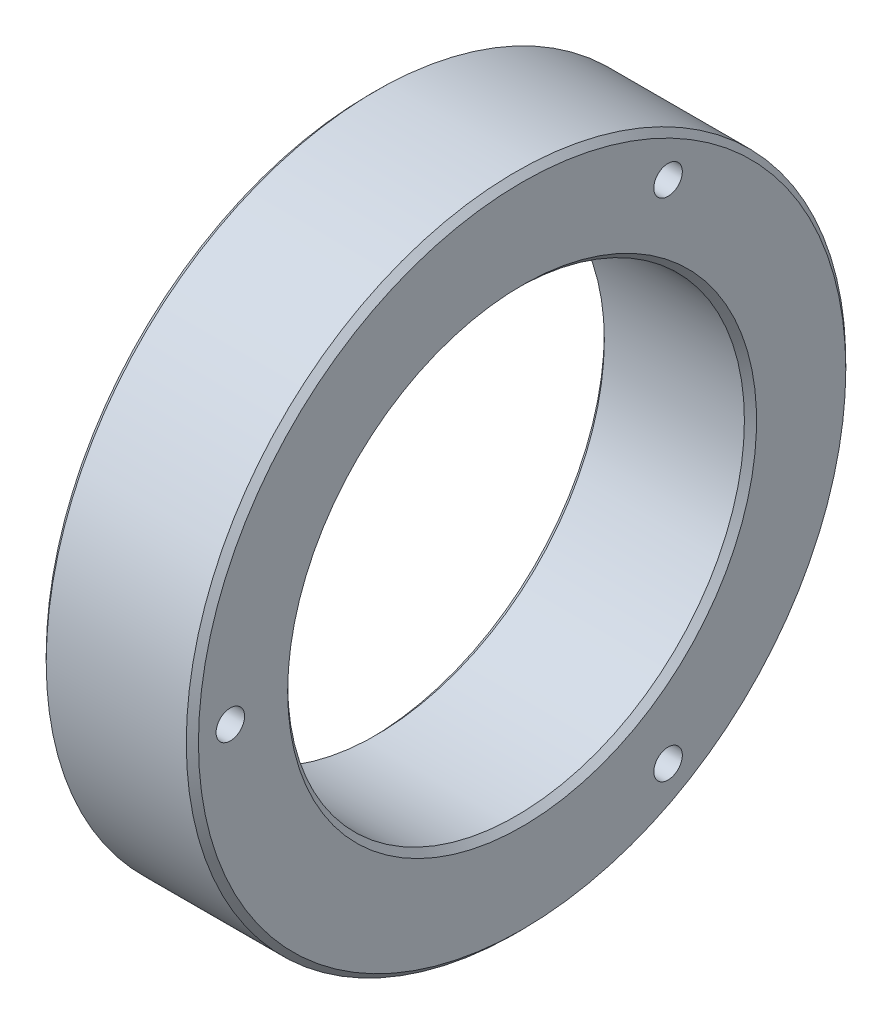
ISO-10303-21;
HEADER;
FILE_DESCRIPTION(('STEP AP214'),'2;1');
FILE_NAME('part.step','',(''),(''),'','','');
FILE_SCHEMA(('AUTOMOTIVE_DESIGN { 1 0 10303 214 1 1 1 1 }'));
ENDSEC;
DATA;
#1=APPLICATION_CONTEXT('core data for automotive mechanical design processes');
#2=APPLICATION_PROTOCOL_DEFINITION('international standard','automotive_design',2000,#1);
#3=PRODUCT_CONTEXT('',#1,'mechanical');
#4=PRODUCT('Part','Part','',(#3));
#5=PRODUCT_RELATED_PRODUCT_CATEGORY('part','',(#4));
#6=PRODUCT_DEFINITION_FORMATION('','',#4);
#7=PRODUCT_DEFINITION_CONTEXT('part definition',#1,'design');
#8=PRODUCT_DEFINITION('design','',#6,#7);
#9=PRODUCT_DEFINITION_SHAPE('','',#8);
#10=(LENGTH_UNIT() NAMED_UNIT(*) SI_UNIT(.MILLI.,.METRE.));
#11=(NAMED_UNIT(*) PLANE_ANGLE_UNIT() SI_UNIT($,.RADIAN.));
#12=(NAMED_UNIT(*) SI_UNIT($,.STERADIAN.) SOLID_ANGLE_UNIT());
#13=UNCERTAINTY_MEASURE_WITH_UNIT(LENGTH_MEASURE(1.E-05),#10,'distance_accuracy_value','');
#14=(GEOMETRIC_REPRESENTATION_CONTEXT(3) GLOBAL_UNCERTAINTY_ASSIGNED_CONTEXT((#13)) GLOBAL_UNIT_ASSIGNED_CONTEXT((#10,
#11,#12)) REPRESENTATION_CONTEXT('',''));
#15=CARTESIAN_POINT('',(0.,0.,0.));
#16=DIRECTION('',(0.,0.,1.));
#17=DIRECTION('',(1.,0.,0.));
#18=AXIS2_PLACEMENT_3D('',#15,#16,#17);
#19=CARTESIAN_POINT('',(0.,57.15,0.));
#20=DIRECTION('',(1.,0.,0.));
#21=DIRECTION('',(0.,0.,-1.));
#22=AXIS2_PLACEMENT_3D('',#19,#20,#21);
#23=PLANE('',#22);
#24=CARTESIAN_POINT('',(0.,69.85,0.));
#25=DIRECTION('',(1.,0.,0.));
#26=DIRECTION('',(0.,0.,-1.));
#27=AXIS2_PLACEMENT_3D('',#24,#25,#26);
#28=CIRCLE('',#27,3.96874999999999);
#29=CARTESIAN_POINT('',(0.,69.85,-3.96874999999999));
#30=VERTEX_POINT('',#29);
#31=EDGE_CURVE('E237',#30,#30,#28,.T.);
#32=ORIENTED_EDGE('',*,*,#31,.T.);
#33=EDGE_LOOP('',(#32));
#34=FACE_BOUND('',#33,.T.);
#35=CARTESIAN_POINT('',(0.,-69.85,0.));
#36=DIRECTION('',(1.,0.,0.));
#37=DIRECTION('',(0.,0.,-1.));
#38=AXIS2_PLACEMENT_3D('',#35,#36,#37);
#39=CIRCLE('',#38,3.96874999999999);
#40=CARTESIAN_POINT('',(0.,-69.85,-3.96874999999999));
#41=VERTEX_POINT('',#40);
#42=EDGE_CURVE('E96',#41,#41,#39,.T.);
#43=ORIENTED_EDGE('',*,*,#42,.T.);
#44=EDGE_LOOP('',(#43));
#45=FACE_BOUND('',#44,.T.);
#46=CARTESIAN_POINT('',(0.,63.246,-36.5252));
#47=DIRECTION('',(1.,0.,0.));
#48=DIRECTION('',(0.,0.,-1.));
#49=AXIS2_PLACEMENT_3D('',#46,#47,#48);
#50=CIRCLE('',#49,5.5626);
#51=CARTESIAN_POINT('',(0.,63.246,-42.0878));
#52=VERTEX_POINT('',#51);
#53=EDGE_CURVE('E88',#52,#52,#50,.T.);
#54=ORIENTED_EDGE('',*,*,#53,.T.);
#55=EDGE_LOOP('',(#54));
#56=FACE_BOUND('',#55,.T.);
#57=CARTESIAN_POINT('',(0.,-63.246,-36.5252));
#58=DIRECTION('',(1.,0.,0.));
#59=DIRECTION('',(0.,0.,-1.));
#60=AXIS2_PLACEMENT_3D('',#57,#58,#59);
#61=CIRCLE('',#60,5.5626);
#62=CARTESIAN_POINT('',(0.,-63.246,-42.0878));
#63=VERTEX_POINT('',#62);
#64=EDGE_CURVE('E78',#63,#63,#61,.T.);
#65=ORIENTED_EDGE('',*,*,#64,.T.);
#66=EDGE_LOOP('',(#65));
#67=FACE_BOUND('',#66,.T.);
#68=CARTESIAN_POINT('',(0.,0.,73.025));
#69=DIRECTION('',(1.,0.,0.));
#70=DIRECTION('',(0.,0.,-1.));
#71=AXIS2_PLACEMENT_3D('',#68,#69,#70);
#72=CIRCLE('',#71,5.5626);
#73=CARTESIAN_POINT('',(0.,0.,67.4624));
#74=VERTEX_POINT('',#73);
#75=EDGE_CURVE('E72',#74,#74,#72,.T.);
#76=ORIENTED_EDGE('',*,*,#75,.T.);
#77=EDGE_LOOP('',(#76));
#78=FACE_BOUND('',#77,.T.);
#79=CARTESIAN_POINT('',(0.,0.,0.));
#80=DIRECTION('',(1.,0.,0.));
#81=DIRECTION('',(0.,0.,-1.));
#82=AXIS2_PLACEMENT_3D('',#79,#80,#81);
#83=CIRCLE('',#82,58.674);
#84=CARTESIAN_POINT('',(0.,0.,-58.674));
#85=VERTEX_POINT('',#84);
#86=EDGE_CURVE('E57',#85,#85,#83,.T.);
#87=ORIENTED_EDGE('',*,*,#86,.T.);
#88=EDGE_LOOP('',(#87));
#89=FACE_BOUND('',#88,.T.);
#90=CARTESIAN_POINT('',(0.,0.,0.));
#91=DIRECTION('',(1.,0.,0.));
#92=DIRECTION('',(0.,0.,-1.));
#93=AXIS2_PLACEMENT_3D('',#90,#91,#92);
#94=CIRCLE('',#93,81.0006);
#95=CARTESIAN_POINT('',(0.,0.,-81.0006));
#96=VERTEX_POINT('',#95);
#97=EDGE_CURVE('E116',#96,#96,#94,.F.);
#98=ORIENTED_EDGE('',*,*,#97,.T.);
#99=EDGE_LOOP('',(#98));
#100=FACE_BOUND('',#99,.T.);
#101=ADVANCED_FACE('F43',(#34,#45,#56,#67,#78,#89,#100),#23,.F.);
#102=CARTESIAN_POINT('',(-25.4,0.,0.));
#103=DIRECTION('',(-1.,0.,0.));
#104=DIRECTION('',(0.,0.,1.));
#105=AXIS2_PLACEMENT_3D('',#102,#103,#104);
#106=CYLINDRICAL_SURFACE('',#105,82.5246);
#107=CARTESIAN_POINT('',(36.576,0.,0.));
#108=DIRECTION('',(-1.,0.,0.));
#109=DIRECTION('',(0.,0.,1.));
#110=AXIS2_PLACEMENT_3D('',#107,#108,#109);
#111=CIRCLE('',#110,82.5246);
#112=CARTESIAN_POINT('',(36.576,0.,82.5246));
#113=VERTEX_POINT('',#112);
#114=EDGE_CURVE('E10',#113,#113,#111,.T.);
#115=ORIENTED_EDGE('',*,*,#114,.T.);
#116=EDGE_LOOP('',(#115));
#117=FACE_BOUND('',#116,.T.);
#118=CARTESIAN_POINT('',(1.524,0.,0.));
#119=DIRECTION('',(1.,0.,0.));
#120=DIRECTION('',(0.,0.,-1.));
#121=AXIS2_PLACEMENT_3D('',#118,#119,#120);
#122=CIRCLE('',#121,82.5246);
#123=CARTESIAN_POINT('',(1.524,0.,-82.5246));
#124=VERTEX_POINT('',#123);
#125=EDGE_CURVE('E52',#124,#124,#122,.T.);
#126=ORIENTED_EDGE('',*,*,#125,.T.);
#127=EDGE_LOOP('',(#126));
#128=FACE_BOUND('',#127,.T.);
#129=ADVANCED_FACE('F143',(#117,#128),#106,.T.);
#130=CARTESIAN_POINT('',(38.1,82.5246,0.));
#131=DIRECTION('',(-1.,0.,0.));
#132=DIRECTION('',(0.,0.,1.));
#133=AXIS2_PLACEMENT_3D('',#130,#131,#132);
#134=PLANE('',#133);
#135=CARTESIAN_POINT('',(38.1,63.246,-36.5252));
#136=DIRECTION('',(-1.,0.,0.));
#137=DIRECTION('',(0.,0.,1.));
#138=AXIS2_PLACEMENT_3D('',#135,#136,#137);
#139=CIRCLE('',#138,3.5687);
#140=CARTESIAN_POINT('',(38.1,63.246,-32.9565));
#141=VERTEX_POINT('',#140);
#142=EDGE_CURVE('E76',#141,#141,#139,.F.);
#143=ORIENTED_EDGE('',*,*,#142,.F.);
#144=EDGE_LOOP('',(#143));
#145=FACE_BOUND('',#144,.T.);
#146=CARTESIAN_POINT('',(38.1,-63.246,-36.5252));
#147=DIRECTION('',(-1.,0.,0.));
#148=DIRECTION('',(0.,0.,1.));
#149=AXIS2_PLACEMENT_3D('',#146,#147,#148);
#150=CIRCLE('',#149,3.5687);
#151=CARTESIAN_POINT('',(38.1,-63.246,-32.9565));
#152=VERTEX_POINT('',#151);
#153=EDGE_CURVE('E69',#152,#152,#150,.F.);
#154=ORIENTED_EDGE('',*,*,#153,.F.);
#155=EDGE_LOOP('',(#154));
#156=FACE_BOUND('',#155,.T.);
#157=CARTESIAN_POINT('',(38.1,0.,73.025));
#158=DIRECTION('',(-1.,0.,0.));
#159=DIRECTION('',(0.,0.,1.));
#160=AXIS2_PLACEMENT_3D('',#157,#158,#159);
#161=CIRCLE('',#160,3.5687);
#162=CARTESIAN_POINT('',(38.1,0.,76.5937));
#163=VERTEX_POINT('',#162);
#164=EDGE_CURVE('E61',#163,#163,#161,.F.);
#165=ORIENTED_EDGE('',*,*,#164,.F.);
#166=EDGE_LOOP('',(#165));
#167=FACE_BOUND('',#166,.T.);
#168=CARTESIAN_POINT('',(38.1,0.,0.));
#169=DIRECTION('',(-1.,0.,0.));
#170=DIRECTION('',(0.,0.,1.));
#171=AXIS2_PLACEMENT_3D('',#168,#169,#170);
#172=CIRCLE('',#171,58.674);
#173=CARTESIAN_POINT('',(38.1,0.,58.674));
#174=VERTEX_POINT('',#173);
#175=EDGE_CURVE('E107',#174,#174,#172,.T.);
#176=ORIENTED_EDGE('',*,*,#175,.T.);
#177=EDGE_LOOP('',(#176));
#178=FACE_BOUND('',#177,.T.);
#179=CARTESIAN_POINT('',(38.1,0.,0.));
#180=DIRECTION('',(-1.,0.,0.));
#181=DIRECTION('',(0.,0.,1.));
#182=AXIS2_PLACEMENT_3D('',#179,#180,#181);
#183=CIRCLE('',#182,81.0006);
#184=CARTESIAN_POINT('',(38.1,0.,81.0006));
#185=VERTEX_POINT('',#184);
#186=EDGE_CURVE('E64',#185,#185,#183,.F.);
#187=ORIENTED_EDGE('',*,*,#186,.T.);
#188=EDGE_LOOP('',(#187));
#189=FACE_BOUND('',#188,.T.);
#190=ADVANCED_FACE('F133',(#145,#156,#167,#178,#189),#134,.F.);
#191=CARTESIAN_POINT('',(-25.4,0.,0.));
#192=DIRECTION('',(-1.,0.,0.));
#193=DIRECTION('',(0.,0.,1.));
#194=AXIS2_PLACEMENT_3D('',#191,#192,#193);
#195=CYLINDRICAL_SURFACE('',#194,57.15);
#196=CARTESIAN_POINT('',(36.576,0.,0.));
#197=DIRECTION('',(-1.,0.,0.));
#198=DIRECTION('',(0.,0.,1.));
#199=AXIS2_PLACEMENT_3D('',#196,#197,#198);
#200=CIRCLE('',#199,57.15);
#201=CARTESIAN_POINT('',(36.576,0.,57.15));
#202=VERTEX_POINT('',#201);
#203=EDGE_CURVE('E113',#202,#202,#200,.F.);
#204=ORIENTED_EDGE('',*,*,#203,.T.);
#205=EDGE_LOOP('',(#204));
#206=FACE_BOUND('',#205,.T.);
#207=CARTESIAN_POINT('',(1.52399999999998,0.,0.));
#208=DIRECTION('',(1.,0.,0.));
#209=DIRECTION('',(0.,0.,-1.));
#210=AXIS2_PLACEMENT_3D('',#207,#208,#209);
#211=CIRCLE('',#210,57.15);
#212=CARTESIAN_POINT('',(1.52399999999998,0.,-57.15));
#213=VERTEX_POINT('',#212);
#214=EDGE_CURVE('E110',#213,#213,#211,.F.);
#215=ORIENTED_EDGE('',*,*,#214,.T.);
#216=EDGE_LOOP('',(#215));
#217=FACE_BOUND('',#216,.T.);
#218=ADVANCED_FACE('F131',(#206,#217),#195,.F.);
#219=CARTESIAN_POINT('',(38.1,0.,0.));
#220=DIRECTION('',(1.,0.,0.));
#221=DIRECTION('',(0.,0.,-1.));
#222=AXIS2_PLACEMENT_3D('',#219,#220,#221);
#223=CONICAL_SURFACE('',#222,58.674,0.785398163397444);
#224=ORIENTED_EDGE('',*,*,#203,.F.);
#225=EDGE_LOOP('',(#224));
#226=FACE_BOUND('',#225,.T.);
#227=ORIENTED_EDGE('',*,*,#175,.F.);
#228=EDGE_LOOP('',(#227));
#229=FACE_BOUND('',#228,.T.);
#230=ADVANCED_FACE('F127',(#226,#229),#223,.F.);
#231=CARTESIAN_POINT('',(1.52399999999998,0.,0.));
#232=DIRECTION('',(-1.,0.,0.));
#233=DIRECTION('',(0.,0.,1.));
#234=AXIS2_PLACEMENT_3D('',#231,#232,#233);
#235=CONICAL_SURFACE('',#234,57.15,0.785398163397455);
#236=ORIENTED_EDGE('',*,*,#86,.F.);
#237=EDGE_LOOP('',(#236));
#238=FACE_BOUND('',#237,.T.);
#239=ORIENTED_EDGE('',*,*,#214,.F.);
#240=EDGE_LOOP('',(#239));
#241=FACE_BOUND('',#240,.T.);
#242=ADVANCED_FACE('F123',(#238,#241),#235,.F.);
#243=CARTESIAN_POINT('',(36.576,0.,0.));
#244=DIRECTION('',(-1.,0.,0.));
#245=DIRECTION('',(0.,0.,1.));
#246=AXIS2_PLACEMENT_3D('',#243,#244,#245);
#247=CONICAL_SURFACE('',#246,82.5246,0.785398163397451);
#248=ORIENTED_EDGE('',*,*,#186,.F.);
#249=EDGE_LOOP('',(#248));
#250=FACE_BOUND('',#249,.T.);
#251=ORIENTED_EDGE('',*,*,#114,.F.);
#252=EDGE_LOOP('',(#251));
#253=FACE_BOUND('',#252,.T.);
#254=ADVANCED_FACE('F126',(#250,#253),#247,.T.);
#255=CARTESIAN_POINT('',(0.,0.,0.));
#256=DIRECTION('',(1.,0.,0.));
#257=DIRECTION('',(0.,0.,-1.));
#258=AXIS2_PLACEMENT_3D('',#255,#256,#257);
#259=CONICAL_SURFACE('',#258,81.0006,0.785398163397448);
#260=ORIENTED_EDGE('',*,*,#125,.F.);
#261=EDGE_LOOP('',(#260));
#262=FACE_BOUND('',#261,.T.);
#263=ORIENTED_EDGE('',*,*,#97,.F.);
#264=EDGE_LOOP('',(#263));
#265=FACE_BOUND('',#264,.T.);
#266=ADVANCED_FACE('F46',(#262,#265),#259,.T.);
#267=CARTESIAN_POINT('',(76.2,0.,73.025));
#268=DIRECTION('',(-1.,0.,0.));
#269=DIRECTION('',(0.,0.,1.));
#270=AXIS2_PLACEMENT_3D('',#267,#268,#269);
#271=CYLINDRICAL_SURFACE('',#270,3.5687);
#272=CARTESIAN_POINT('',(9.65199999999999,0.,73.025));
#273=DIRECTION('',(1.,0.,0.));
#274=DIRECTION('',(0.,0.,-1.));
#275=AXIS2_PLACEMENT_3D('',#272,#273,#274);
#276=CIRCLE('',#275,3.5687);
#277=CARTESIAN_POINT('',(9.65199999999999,0.,69.4563));
#278=VERTEX_POINT('',#277);
#279=EDGE_CURVE('E65',#278,#278,#276,.T.);
#280=ORIENTED_EDGE('',*,*,#279,.F.);
#281=EDGE_LOOP('',(#280));
#282=FACE_BOUND('',#281,.T.);
#283=ORIENTED_EDGE('',*,*,#164,.T.);
#284=EDGE_LOOP('',(#283));
#285=FACE_BOUND('',#284,.T.);
#286=ADVANCED_FACE('F171',(#282,#285),#271,.F.);
#287=CARTESIAN_POINT('',(9.652,0.,73.025));
#288=DIRECTION('',(-1.,0.,0.));
#289=DIRECTION('',(0.,0.,1.));
#290=AXIS2_PLACEMENT_3D('',#287,#288,#289);
#291=CYLINDRICAL_SURFACE('',#290,5.5626);
#292=CARTESIAN_POINT('',(9.652,0.,73.025));
#293=DIRECTION('',(1.,0.,0.));
#294=DIRECTION('',(0.,0.,-1.));
#295=AXIS2_PLACEMENT_3D('',#292,#293,#294);
#296=CIRCLE('',#295,5.5626);
#297=CARTESIAN_POINT('',(9.652,0.,67.4624));
#298=VERTEX_POINT('',#297);
#299=EDGE_CURVE('E68',#298,#298,#296,.T.);
#300=ORIENTED_EDGE('',*,*,#299,.T.);
#301=EDGE_LOOP('',(#300));
#302=FACE_BOUND('',#301,.T.);
#303=ORIENTED_EDGE('',*,*,#75,.F.);
#304=EDGE_LOOP('',(#303));
#305=FACE_BOUND('',#304,.T.);
#306=ADVANCED_FACE('F179',(#302,#305),#291,.F.);
#307=CARTESIAN_POINT('',(9.652,0.,73.025));
#308=DIRECTION('',(1.,0.,0.));
#309=DIRECTION('',(0.,0.,-1.));
#310=AXIS2_PLACEMENT_3D('',#307,#308,#309);
#311=PLANE('',#310);
#312=ORIENTED_EDGE('',*,*,#279,.T.);
#313=EDGE_LOOP('',(#312));
#314=FACE_BOUND('',#313,.T.);
#315=ORIENTED_EDGE('',*,*,#299,.F.);
#316=EDGE_LOOP('',(#315));
#317=FACE_BOUND('',#316,.T.);
#318=ADVANCED_FACE('F188',(#314,#317),#311,.F.);
#319=CARTESIAN_POINT('',(76.2,-63.246,-36.5252));
#320=DIRECTION('',(-1.,0.,0.));
#321=DIRECTION('',(0.,0.,1.));
#322=AXIS2_PLACEMENT_3D('',#319,#320,#321);
#323=CYLINDRICAL_SURFACE('',#322,3.5687);
#324=CARTESIAN_POINT('',(9.65199999999999,-63.246,-36.5252));
#325=DIRECTION('',(1.,0.,0.));
#326=DIRECTION('',(0.,0.,-1.));
#327=AXIS2_PLACEMENT_3D('',#324,#325,#326);
#328=CIRCLE('',#327,3.5687);
#329=CARTESIAN_POINT('',(9.65199999999999,-63.246,-40.0939));
#330=VERTEX_POINT('',#329);
#331=EDGE_CURVE('E73',#330,#330,#328,.T.);
#332=ORIENTED_EDGE('',*,*,#331,.F.);
#333=EDGE_LOOP('',(#332));
#334=FACE_BOUND('',#333,.T.);
#335=ORIENTED_EDGE('',*,*,#153,.T.);
#336=EDGE_LOOP('',(#335));
#337=FACE_BOUND('',#336,.T.);
#338=ADVANCED_FACE('F196',(#334,#337),#323,.F.);
#339=CARTESIAN_POINT('',(9.652,-63.246,-36.5252));
#340=DIRECTION('',(-1.,0.,0.));
#341=DIRECTION('',(0.,0.,1.));
#342=AXIS2_PLACEMENT_3D('',#339,#340,#341);
#343=CYLINDRICAL_SURFACE('',#342,5.5626);
#344=CARTESIAN_POINT('',(9.652,-63.246,-36.5252));
#345=DIRECTION('',(1.,0.,0.));
#346=DIRECTION('',(0.,0.,-1.));
#347=AXIS2_PLACEMENT_3D('',#344,#345,#346);
#348=CIRCLE('',#347,5.5626);
#349=CARTESIAN_POINT('',(9.652,-63.246,-42.0878));
#350=VERTEX_POINT('',#349);
#351=EDGE_CURVE('E75',#350,#350,#348,.T.);
#352=ORIENTED_EDGE('',*,*,#351,.T.);
#353=EDGE_LOOP('',(#352));
#354=FACE_BOUND('',#353,.T.);
#355=ORIENTED_EDGE('',*,*,#64,.F.);
#356=EDGE_LOOP('',(#355));
#357=FACE_BOUND('',#356,.T.);
#358=ADVANCED_FACE('F200',(#354,#357),#343,.F.);
#359=CARTESIAN_POINT('',(9.652,-63.246,-36.5252));
#360=DIRECTION('',(1.,0.,0.));
#361=DIRECTION('',(0.,0.,-1.));
#362=AXIS2_PLACEMENT_3D('',#359,#360,#361);
#363=PLANE('',#362);
#364=ORIENTED_EDGE('',*,*,#331,.T.);
#365=EDGE_LOOP('',(#364));
#366=FACE_BOUND('',#365,.T.);
#367=ORIENTED_EDGE('',*,*,#351,.F.);
#368=EDGE_LOOP('',(#367));
#369=FACE_BOUND('',#368,.T.);
#370=ADVANCED_FACE('F204',(#366,#369),#363,.F.);
#371=CARTESIAN_POINT('',(76.2,63.246,-36.5252));
#372=DIRECTION('',(-1.,0.,0.));
#373=DIRECTION('',(0.,0.,1.));
#374=AXIS2_PLACEMENT_3D('',#371,#372,#373);
#375=CYLINDRICAL_SURFACE('',#374,3.5687);
#376=CARTESIAN_POINT('',(9.65199999999999,63.246,-36.5252));
#377=DIRECTION('',(1.,0.,0.));
#378=DIRECTION('',(0.,0.,-1.));
#379=AXIS2_PLACEMENT_3D('',#376,#377,#378);
#380=CIRCLE('',#379,3.5687);
#381=CARTESIAN_POINT('',(9.65199999999999,63.246,-40.0939));
#382=VERTEX_POINT('',#381);
#383=EDGE_CURVE('E48',#382,#382,#380,.T.);
#384=ORIENTED_EDGE('',*,*,#383,.F.);
#385=EDGE_LOOP('',(#384));
#386=FACE_BOUND('',#385,.T.);
#387=ORIENTED_EDGE('',*,*,#142,.T.);
#388=EDGE_LOOP('',(#387));
#389=FACE_BOUND('',#388,.T.);
#390=ADVANCED_FACE('F208',(#386,#389),#375,.F.);
#391=CARTESIAN_POINT('',(9.652,63.246,-36.5252));
#392=DIRECTION('',(-1.,0.,0.));
#393=DIRECTION('',(0.,0.,1.));
#394=AXIS2_PLACEMENT_3D('',#391,#392,#393);
#395=CYLINDRICAL_SURFACE('',#394,5.5626);
#396=CARTESIAN_POINT('',(9.652,63.246,-36.5252));
#397=DIRECTION('',(1.,0.,0.));
#398=DIRECTION('',(0.,0.,-1.));
#399=AXIS2_PLACEMENT_3D('',#396,#397,#398);
#400=CIRCLE('',#399,5.5626);
#401=CARTESIAN_POINT('',(9.652,63.246,-42.0878));
#402=VERTEX_POINT('',#401);
#403=EDGE_CURVE('E84',#402,#402,#400,.T.);
#404=ORIENTED_EDGE('',*,*,#403,.T.);
#405=EDGE_LOOP('',(#404));
#406=FACE_BOUND('',#405,.T.);
#407=ORIENTED_EDGE('',*,*,#53,.F.);
#408=EDGE_LOOP('',(#407));
#409=FACE_BOUND('',#408,.T.);
#410=ADVANCED_FACE('F212',(#406,#409),#395,.F.);
#411=CARTESIAN_POINT('',(9.652,63.246,-36.5252));
#412=DIRECTION('',(1.,0.,0.));
#413=DIRECTION('',(0.,0.,-1.));
#414=AXIS2_PLACEMENT_3D('',#411,#412,#413);
#415=PLANE('',#414);
#416=ORIENTED_EDGE('',*,*,#383,.T.);
#417=EDGE_LOOP('',(#416));
#418=FACE_BOUND('',#417,.T.);
#419=ORIENTED_EDGE('',*,*,#403,.F.);
#420=EDGE_LOOP('',(#419));
#421=FACE_BOUND('',#420,.T.);
#422=ADVANCED_FACE('F216',(#418,#421),#415,.F.);
#423=CARTESIAN_POINT('',(25.4,-69.85,0.));
#424=DIRECTION('',(-1.,0.,0.));
#425=DIRECTION('',(0.,0.,1.));
#426=AXIS2_PLACEMENT_3D('',#423,#424,#425);
#427=CYLINDRICAL_SURFACE('',#426,3.96874999999999);
#428=CARTESIAN_POINT('',(25.4,-69.85,0.));
#429=DIRECTION('',(1.,0.,0.));
#430=DIRECTION('',(0.,0.,-1.));
#431=AXIS2_PLACEMENT_3D('',#428,#429,#430);
#432=CIRCLE('',#431,3.96874999999999);
#433=CARTESIAN_POINT('',(25.4,-69.85,-3.96874999999999));
#434=VERTEX_POINT('',#433);
#435=EDGE_CURVE('E93',#434,#434,#432,.T.);
#436=ORIENTED_EDGE('',*,*,#435,.T.);
#437=EDGE_LOOP('',(#436));
#438=FACE_BOUND('',#437,.T.);
#439=ORIENTED_EDGE('',*,*,#42,.F.);
#440=EDGE_LOOP('',(#439));
#441=FACE_BOUND('',#440,.T.);
#442=ADVANCED_FACE('F219',(#438,#441),#427,.F.);
#443=CARTESIAN_POINT('',(25.4,-69.85,0.));
#444=DIRECTION('',(1.,0.,0.));
#445=DIRECTION('',(0.,0.,-1.));
#446=AXIS2_PLACEMENT_3D('',#443,#444,#445);
#447=PLANE('',#446);
#448=ORIENTED_EDGE('',*,*,#435,.F.);
#449=EDGE_LOOP('',(#448));
#450=FACE_BOUND('',#449,.T.);
#451=ADVANCED_FACE('F222',(#450),#447,.F.);
#452=CARTESIAN_POINT('',(25.4,69.85,0.));
#453=DIRECTION('',(-1.,0.,0.));
#454=DIRECTION('',(0.,0.,1.));
#455=AXIS2_PLACEMENT_3D('',#452,#453,#454);
#456=CYLINDRICAL_SURFACE('',#455,3.96874999999999);
#457=CARTESIAN_POINT('',(25.4,69.85,0.));
#458=DIRECTION('',(1.,0.,0.));
#459=DIRECTION('',(0.,0.,-1.));
#460=AXIS2_PLACEMENT_3D('',#457,#458,#459);
#461=CIRCLE('',#460,3.96874999999999);
#462=CARTESIAN_POINT('',(25.4,69.85,-3.96874999999999));
#463=VERTEX_POINT('',#462);
#464=EDGE_CURVE('E236',#463,#463,#461,.T.);
#465=ORIENTED_EDGE('',*,*,#464,.T.);
#466=EDGE_LOOP('',(#465));
#467=FACE_BOUND('',#466,.T.);
#468=ORIENTED_EDGE('',*,*,#31,.F.);
#469=EDGE_LOOP('',(#468));
#470=FACE_BOUND('',#469,.T.);
#471=ADVANCED_FACE('F225',(#467,#470),#456,.F.);
#472=CARTESIAN_POINT('',(25.4,69.85,0.));
#473=DIRECTION('',(1.,0.,0.));
#474=DIRECTION('',(0.,0.,-1.));
#475=AXIS2_PLACEMENT_3D('',#472,#473,#474);
#476=PLANE('',#475);
#477=ORIENTED_EDGE('',*,*,#464,.F.);
#478=EDGE_LOOP('',(#477));
#479=FACE_BOUND('',#478,.T.);
#480=ADVANCED_FACE('F228',(#479),#476,.F.);
#481=CLOSED_SHELL('',(#101,#129,#190,#218,#230,#242,#254,#266,#286,#306,#318,#338,#358,#370,
#390,#410,#422,#442,#451,#471,#480));
#482=MANIFOLD_SOLID_BREP('B2',#481);
#483=ADVANCED_BREP_SHAPE_REPRESENTATION('',(#18,#482),#14);
#484=SHAPE_DEFINITION_REPRESENTATION(#9,#483);
ENDSEC;
END-ISO-10303-21;
